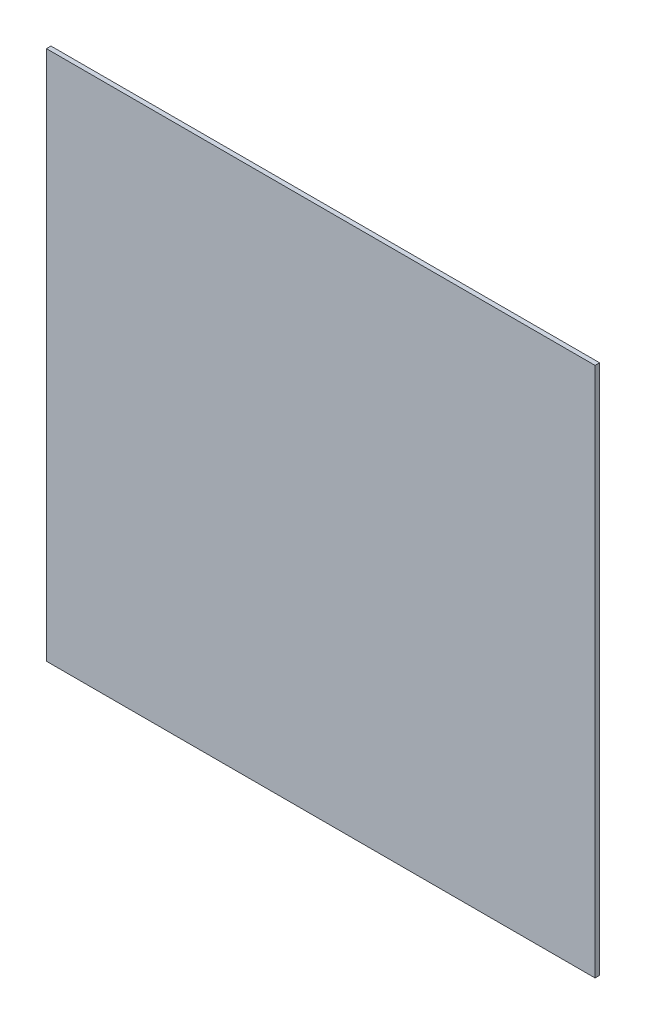
ISO-10303-21;
HEADER;
FILE_DESCRIPTION(('STEP AP214'),'2;1');
FILE_NAME('part.step','',(''),(''),'','','');
FILE_SCHEMA(('AUTOMOTIVE_DESIGN { 1 0 10303 214 1 1 1 1 }'));
ENDSEC;
DATA;
#1=APPLICATION_CONTEXT('core data for automotive mechanical design processes');
#2=APPLICATION_PROTOCOL_DEFINITION('international standard','automotive_design',2000,#1);
#3=PRODUCT_CONTEXT('',#1,'mechanical');
#4=PRODUCT('Part','Part','',(#3));
#5=PRODUCT_RELATED_PRODUCT_CATEGORY('part','',(#4));
#6=PRODUCT_DEFINITION_FORMATION('','',#4);
#7=PRODUCT_DEFINITION_CONTEXT('part definition',#1,'design');
#8=PRODUCT_DEFINITION('design','',#6,#7);
#9=PRODUCT_DEFINITION_SHAPE('','',#8);
#10=(LENGTH_UNIT() NAMED_UNIT(*) SI_UNIT(.MILLI.,.METRE.));
#11=(NAMED_UNIT(*) PLANE_ANGLE_UNIT() SI_UNIT($,.RADIAN.));
#12=(NAMED_UNIT(*) SI_UNIT($,.STERADIAN.) SOLID_ANGLE_UNIT());
#13=UNCERTAINTY_MEASURE_WITH_UNIT(LENGTH_MEASURE(1.E-05),#10,'distance_accuracy_value','');
#14=(GEOMETRIC_REPRESENTATION_CONTEXT(3) GLOBAL_UNCERTAINTY_ASSIGNED_CONTEXT((#13)) GLOBAL_UNIT_ASSIGNED_CONTEXT((#10,
#11,#12)) REPRESENTATION_CONTEXT('',''));
#15=CARTESIAN_POINT('',(0.,0.,0.));
#16=DIRECTION('',(0.,0.,1.));
#17=DIRECTION('',(1.,0.,0.));
#18=AXIS2_PLACEMENT_3D('',#15,#16,#17);
#19=CARTESIAN_POINT('',(302.5,292.5,5.));
#20=DIRECTION('',(-1.,0.,0.));
#21=DIRECTION('',(0.,-1.,0.));
#22=AXIS2_PLACEMENT_3D('',#19,#20,#21);
#23=PLANE('',#22);
#24=DIRECTION('',(0.,1.,0.));
#25=VECTOR('',#24,1.);
#26=CARTESIAN_POINT('',(302.5,292.5,0.));
#27=LINE('',#26,#25);
#28=CARTESIAN_POINT('',(302.5,-292.5,0.));
#29=VERTEX_POINT('',#28);
#30=CARTESIAN_POINT('',(302.5,292.5,0.));
#31=VERTEX_POINT('',#30);
#32=EDGE_CURVE('E96',#29,#31,#27,.T.);
#33=ORIENTED_EDGE('',*,*,#32,.T.);
#34=DIRECTION('',(0.,0.,-1.));
#35=VECTOR('',#34,1.);
#36=CARTESIAN_POINT('',(302.5,292.5,5.));
#37=LINE('',#36,#35);
#38=CARTESIAN_POINT('',(302.5,292.5,5.));
#39=VERTEX_POINT('',#38);
#40=EDGE_CURVE('E11',#39,#31,#37,.T.);
#41=ORIENTED_EDGE('',*,*,#40,.F.);
#42=DIRECTION('',(0.,1.,0.));
#43=VECTOR('',#42,1.);
#44=CARTESIAN_POINT('',(302.5,292.5,5.));
#45=LINE('',#44,#43);
#46=CARTESIAN_POINT('',(302.5,-292.5,5.));
#47=VERTEX_POINT('',#46);
#48=EDGE_CURVE('E84',#47,#39,#45,.T.);
#49=ORIENTED_EDGE('',*,*,#48,.F.);
#50=DIRECTION('',(0.,0.,-1.));
#51=VECTOR('',#50,1.);
#52=CARTESIAN_POINT('',(302.5,-292.5,5.));
#53=LINE('',#52,#51);
#54=EDGE_CURVE('E92',#47,#29,#53,.T.);
#55=ORIENTED_EDGE('',*,*,#54,.T.);
#56=EDGE_LOOP('',(#33,#41,#49,#55));
#57=FACE_BOUND('',#56,.T.);
#58=ADVANCED_FACE('F33',(#57),#23,.F.);
#59=CARTESIAN_POINT('',(-302.5,292.5,5.));
#60=DIRECTION('',(0.,-1.,0.));
#61=DIRECTION('',(0.,0.,-1.));
#62=AXIS2_PLACEMENT_3D('',#59,#60,#61);
#63=PLANE('',#62);
#64=DIRECTION('',(-1.,0.,0.));
#65=VECTOR('',#64,1.);
#66=CARTESIAN_POINT('',(-302.5,292.5,0.));
#67=LINE('',#66,#65);
#68=CARTESIAN_POINT('',(-302.5,292.5,0.));
#69=VERTEX_POINT('',#68);
#70=EDGE_CURVE('E88',#31,#69,#67,.T.);
#71=ORIENTED_EDGE('',*,*,#70,.T.);
#72=DIRECTION('',(0.,0.,-1.));
#73=VECTOR('',#72,1.);
#74=CARTESIAN_POINT('',(-302.5,292.5,5.));
#75=LINE('',#74,#73);
#76=CARTESIAN_POINT('',(-302.5,292.5,5.));
#77=VERTEX_POINT('',#76);
#78=EDGE_CURVE('E41',#77,#69,#75,.T.);
#79=ORIENTED_EDGE('',*,*,#78,.F.);
#80=DIRECTION('',(-1.,0.,0.));
#81=VECTOR('',#80,1.);
#82=CARTESIAN_POINT('',(-302.5,292.5,5.));
#83=LINE('',#82,#81);
#84=EDGE_CURVE('E79',#39,#77,#83,.T.);
#85=ORIENTED_EDGE('',*,*,#84,.F.);
#86=ORIENTED_EDGE('',*,*,#40,.T.);
#87=EDGE_LOOP('',(#71,#79,#85,#86));
#88=FACE_BOUND('',#87,.T.);
#89=ADVANCED_FACE('F87',(#88),#63,.F.);
#90=CARTESIAN_POINT('',(-302.5,292.5,5.));
#91=DIRECTION('',(1.,0.,0.));
#92=DIRECTION('',(0.,1.,0.));
#93=AXIS2_PLACEMENT_3D('',#90,#91,#92);
#94=PLANE('',#93);
#95=DIRECTION('',(0.,-1.,0.));
#96=VECTOR('',#95,1.);
#97=CARTESIAN_POINT('',(-302.5,292.5,0.));
#98=LINE('',#97,#96);
#99=CARTESIAN_POINT('',(-302.5,-292.5,0.));
#100=VERTEX_POINT('',#99);
#101=EDGE_CURVE('E66',#69,#100,#98,.T.);
#102=ORIENTED_EDGE('',*,*,#101,.T.);
#103=DIRECTION('',(0.,0.,-1.));
#104=VECTOR('',#103,1.);
#105=CARTESIAN_POINT('',(-302.5,-292.5,5.));
#106=LINE('',#105,#104);
#107=CARTESIAN_POINT('',(-302.5,-292.5,5.));
#108=VERTEX_POINT('',#107);
#109=EDGE_CURVE('E89',#108,#100,#106,.T.);
#110=ORIENTED_EDGE('',*,*,#109,.F.);
#111=DIRECTION('',(0.,-1.,0.));
#112=VECTOR('',#111,1.);
#113=CARTESIAN_POINT('',(-302.5,292.5,5.));
#114=LINE('',#113,#112);
#115=EDGE_CURVE('E82',#77,#108,#114,.T.);
#116=ORIENTED_EDGE('',*,*,#115,.F.);
#117=ORIENTED_EDGE('',*,*,#78,.T.);
#118=EDGE_LOOP('',(#102,#110,#116,#117));
#119=FACE_BOUND('',#118,.T.);
#120=ADVANCED_FACE('F90',(#119),#94,.F.);
#121=CARTESIAN_POINT('',(-302.5,-292.5,5.));
#122=DIRECTION('',(0.,1.,0.));
#123=DIRECTION('',(0.,0.,1.));
#124=AXIS2_PLACEMENT_3D('',#121,#122,#123);
#125=PLANE('',#124);
#126=DIRECTION('',(1.,0.,0.));
#127=VECTOR('',#126,1.);
#128=CARTESIAN_POINT('',(-302.5,-292.5,0.));
#129=LINE('',#128,#127);
#130=EDGE_CURVE('E72',#100,#29,#129,.T.);
#131=ORIENTED_EDGE('',*,*,#130,.T.);
#132=ORIENTED_EDGE('',*,*,#54,.F.);
#133=DIRECTION('',(1.,0.,0.));
#134=VECTOR('',#133,1.);
#135=CARTESIAN_POINT('',(-302.5,-292.5,5.));
#136=LINE('',#135,#134);
#137=EDGE_CURVE('E49',#108,#47,#136,.T.);
#138=ORIENTED_EDGE('',*,*,#137,.F.);
#139=ORIENTED_EDGE('',*,*,#109,.T.);
#140=EDGE_LOOP('',(#131,#132,#138,#139));
#141=FACE_BOUND('',#140,.T.);
#142=ADVANCED_FACE('F103',(#141),#125,.F.);
#143=CARTESIAN_POINT('',(0.,0.,5.));
#144=DIRECTION('',(0.,0.,1.));
#145=DIRECTION('',(1.,0.,0.));
#146=AXIS2_PLACEMENT_3D('',#143,#144,#145);
#147=PLANE('',#146);
#148=ORIENTED_EDGE('',*,*,#48,.T.);
#149=ORIENTED_EDGE('',*,*,#84,.T.);
#150=ORIENTED_EDGE('',*,*,#115,.T.);
#151=ORIENTED_EDGE('',*,*,#137,.T.);
#152=EDGE_LOOP('',(#148,#149,#150,#151));
#153=FACE_BOUND('',#152,.T.);
#154=ADVANCED_FACE('F80',(#153),#147,.T.);
#155=CARTESIAN_POINT('',(0.,0.,0.));
#156=DIRECTION('',(0.,0.,1.));
#157=DIRECTION('',(1.,0.,0.));
#158=AXIS2_PLACEMENT_3D('',#155,#156,#157);
#159=PLANE('',#158);
#160=ORIENTED_EDGE('',*,*,#32,.F.);
#161=ORIENTED_EDGE('',*,*,#130,.F.);
#162=ORIENTED_EDGE('',*,*,#101,.F.);
#163=ORIENTED_EDGE('',*,*,#70,.F.);
#164=EDGE_LOOP('',(#160,#161,#162,#163));
#165=FACE_BOUND('',#164,.T.);
#166=ADVANCED_FACE('F106',(#165),#159,.F.);
#167=CLOSED_SHELL('',(#58,#89,#120,#142,#154,#166));
#168=MANIFOLD_SOLID_BREP('B2',#167);
#169=ADVANCED_BREP_SHAPE_REPRESENTATION('',(#18,#168),#14);
#170=SHAPE_DEFINITION_REPRESENTATION(#9,#169);
ENDSEC;
END-ISO-10303-21;
